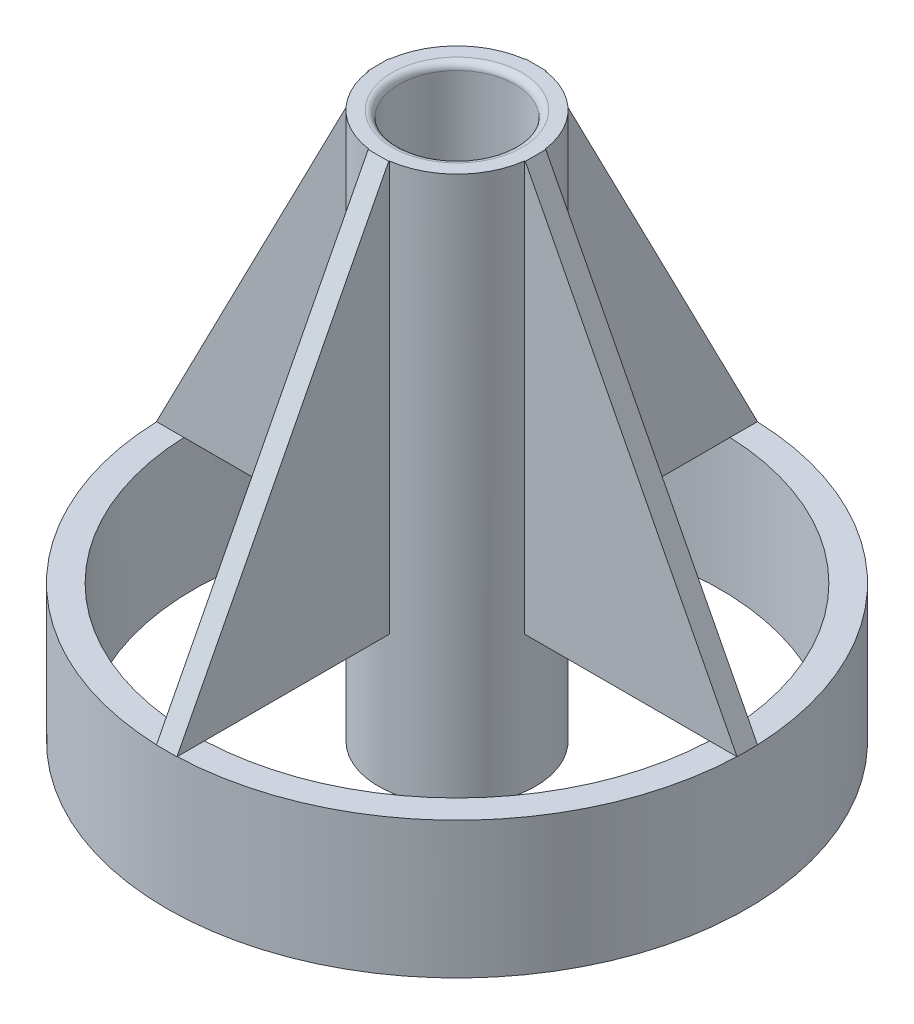
ISO-10303-21;
HEADER;
FILE_DESCRIPTION(('STEP AP214'),'2;1');
FILE_NAME('part.step','',(''),(''),'','','');
FILE_SCHEMA(('AUTOMOTIVE_DESIGN { 1 0 10303 214 1 1 1 1 }'));
ENDSEC;
DATA;
#1=APPLICATION_CONTEXT('core data for automotive mechanical design processes');
#2=APPLICATION_PROTOCOL_DEFINITION('international standard','automotive_design',2000,#1);
#3=PRODUCT_CONTEXT('',#1,'mechanical');
#4=PRODUCT('Part','Part','',(#3));
#5=PRODUCT_RELATED_PRODUCT_CATEGORY('part','',(#4));
#6=PRODUCT_DEFINITION_FORMATION('','',#4);
#7=PRODUCT_DEFINITION_CONTEXT('part definition',#1,'design');
#8=PRODUCT_DEFINITION('design','',#6,#7);
#9=PRODUCT_DEFINITION_SHAPE('','',#8);
#10=(LENGTH_UNIT() NAMED_UNIT(*) SI_UNIT(.MILLI.,.METRE.));
#11=(NAMED_UNIT(*) PLANE_ANGLE_UNIT() SI_UNIT($,.RADIAN.));
#12=(NAMED_UNIT(*) SI_UNIT($,.STERADIAN.) SOLID_ANGLE_UNIT());
#13=UNCERTAINTY_MEASURE_WITH_UNIT(LENGTH_MEASURE(1.E-05),#10,'distance_accuracy_value','');
#14=(GEOMETRIC_REPRESENTATION_CONTEXT(3) GLOBAL_UNCERTAINTY_ASSIGNED_CONTEXT((#13)) GLOBAL_UNIT_ASSIGNED_CONTEXT((#10,
#11,#12)) REPRESENTATION_CONTEXT('',''));
#15=CARTESIAN_POINT('',(0.,0.,0.));
#16=DIRECTION('',(0.,0.,1.));
#17=DIRECTION('',(1.,0.,0.));
#18=AXIS2_PLACEMENT_3D('',#15,#16,#17);
#19=CARTESIAN_POINT('',(-4.25,10.,0.75));
#20=DIRECTION('',(0.,1.,0.));
#21=DIRECTION('',(0.,0.,1.));
#22=AXIS2_PLACEMENT_3D('',#19,#20,#21);
#23=PLANE('',#22);
#24=CARTESIAN_POINT('',(0.,10.,0.));
#25=DIRECTION('',(0.,-1.,0.));
#26=DIRECTION('',(0.,0.,-1.));
#27=AXIS2_PLACEMENT_3D('',#24,#25,#26);
#28=CIRCLE('',#27,5.75);
#29=CARTESIAN_POINT('',(-5.70087712549569,10.,0.75));
#30=VERTEX_POINT('',#29);
#31=CARTESIAN_POINT('',(-5.70087712549569,10.,-0.75));
#32=VERTEX_POINT('',#31);
#33=EDGE_CURVE('E227',#30,#32,#28,.T.);
#34=ORIENTED_EDGE('',*,*,#33,.F.);
#35=DIRECTION('',(1.,0.,0.));
#36=VECTOR('',#35,1.);
#37=CARTESIAN_POINT('',(-5.75,10.,0.75));
#38=LINE('',#37,#36);
#39=CARTESIAN_POINT('',(-19.2353840616713,10.,0.75));
#40=VERTEX_POINT('',#39);
#41=EDGE_CURVE('E584',#40,#30,#38,.T.);
#42=ORIENTED_EDGE('',*,*,#41,.F.);
#43=CARTESIAN_POINT('',(0.,10.,0.));
#44=DIRECTION('',(0.,1.,0.));
#45=DIRECTION('',(0.,0.,1.));
#46=AXIS2_PLACEMENT_3D('',#43,#44,#45);
#47=CIRCLE('',#46,19.25);
#48=CARTESIAN_POINT('',(-19.2353840616713,10.,-0.75));
#49=VERTEX_POINT('',#48);
#50=EDGE_CURVE('E457',#49,#40,#47,.T.);
#51=ORIENTED_EDGE('',*,*,#50,.F.);
#52=DIRECTION('',(1.,0.,0.));
#53=VECTOR('',#52,1.);
#54=CARTESIAN_POINT('',(-4.25,10.,-0.75));
#55=LINE('',#54,#53);
#56=EDGE_CURVE('E549',#49,#32,#55,.T.);
#57=ORIENTED_EDGE('',*,*,#56,.T.);
#58=EDGE_LOOP('',(#34,#42,#51,#57));
#59=FACE_BOUND('',#58,.T.);
#60=ADVANCED_FACE('F38',(#59),#23,.F.);
#61=CARTESIAN_POINT('',(-0.74999999999998,10.,-5.70087712549569));
#62=VERTEX_POINT('',#61);
#63=CARTESIAN_POINT('',(0.75000000000002,10.,-5.70087712549569));
#64=VERTEX_POINT('',#63);
#65=EDGE_CURVE('E213',#62,#64,#28,.T.);
#66=ORIENTED_EDGE('',*,*,#65,.F.);
#67=DIRECTION('',(0.,0.,1.));
#68=VECTOR('',#67,1.);
#69=CARTESIAN_POINT('',(-0.74999999999998,10.,-5.75));
#70=LINE('',#69,#68);
#71=CARTESIAN_POINT('',(-0.749999999999933,10.,-19.2353840616714));
#72=VERTEX_POINT('',#71);
#73=EDGE_CURVE('E265',#72,#62,#70,.T.);
#74=ORIENTED_EDGE('',*,*,#73,.F.);
#75=CARTESIAN_POINT('',(0.750000000000067,10.,-19.2353840616713));
#76=VERTEX_POINT('',#75);
#77=EDGE_CURVE('E244',#76,#72,#47,.T.);
#78=ORIENTED_EDGE('',*,*,#77,.F.);
#79=DIRECTION('',(0.,0.,1.));
#80=VECTOR('',#79,1.);
#81=CARTESIAN_POINT('',(0.750000000000015,10.,-4.25));
#82=LINE('',#81,#80);
#83=EDGE_CURVE('E234',#76,#64,#82,.T.);
#84=ORIENTED_EDGE('',*,*,#83,.T.);
#85=EDGE_LOOP('',(#66,#74,#78,#84));
#86=FACE_BOUND('',#85,.T.);
#87=ADVANCED_FACE('F242',(#86),#23,.F.);
#88=CARTESIAN_POINT('',(5.70087712549569,10.,-0.75));
#89=VERTEX_POINT('',#88);
#90=CARTESIAN_POINT('',(5.70087712549569,10.,0.75));
#91=VERTEX_POINT('',#90);
#92=EDGE_CURVE('E229',#89,#91,#28,.T.);
#93=ORIENTED_EDGE('',*,*,#92,.F.);
#94=DIRECTION('',(-1.,0.,0.));
#95=VECTOR('',#94,1.);
#96=CARTESIAN_POINT('',(5.75,10.,-0.75));
#97=LINE('',#96,#95);
#98=CARTESIAN_POINT('',(19.2353840616713,10.,-0.75));
#99=VERTEX_POINT('',#98);
#100=EDGE_CURVE('E316',#99,#89,#97,.T.);
#101=ORIENTED_EDGE('',*,*,#100,.F.);
#102=CARTESIAN_POINT('',(19.2353840616713,10.,0.75));
#103=VERTEX_POINT('',#102);
#104=EDGE_CURVE('E515',#103,#99,#47,.T.);
#105=ORIENTED_EDGE('',*,*,#104,.F.);
#106=DIRECTION('',(-1.,0.,0.));
#107=VECTOR('',#106,1.);
#108=CARTESIAN_POINT('',(4.25,10.,0.75));
#109=LINE('',#108,#107);
#110=EDGE_CURVE('E321',#103,#91,#109,.T.);
#111=ORIENTED_EDGE('',*,*,#110,.T.);
#112=EDGE_LOOP('',(#93,#101,#105,#111));
#113=FACE_BOUND('',#112,.T.);
#114=ADVANCED_FACE('F417',(#113),#23,.F.);
#115=CARTESIAN_POINT('',(0.74999999999994,10.,5.7008771254957));
#116=VERTEX_POINT('',#115);
#117=CARTESIAN_POINT('',(-0.75000000000006,10.,5.70087712549568));
#118=VERTEX_POINT('',#117);
#119=EDGE_CURVE('E555',#116,#118,#28,.T.);
#120=ORIENTED_EDGE('',*,*,#119,.F.);
#121=DIRECTION('',(0.,0.,-1.));
#122=VECTOR('',#121,1.);
#123=CARTESIAN_POINT('',(0.74999999999994,10.,5.75000000000001));
#124=LINE('',#123,#122);
#125=CARTESIAN_POINT('',(0.749999999999799,10.,19.2353840616714));
#126=VERTEX_POINT('',#125);
#127=EDGE_CURVE('E364',#126,#116,#124,.T.);
#128=ORIENTED_EDGE('',*,*,#127,.F.);
#129=CARTESIAN_POINT('',(-0.750000000000202,10.,19.2353840616713));
#130=VERTEX_POINT('',#129);
#131=EDGE_CURVE('E520',#130,#126,#47,.T.);
#132=ORIENTED_EDGE('',*,*,#131,.F.);
#133=DIRECTION('',(0.,0.,-1.));
#134=VECTOR('',#133,1.);
#135=CARTESIAN_POINT('',(-0.750000000000045,10.,4.24999999999999));
#136=LINE('',#135,#134);
#137=EDGE_CURVE('E369',#130,#118,#136,.T.);
#138=ORIENTED_EDGE('',*,*,#137,.T.);
#139=EDGE_LOOP('',(#120,#128,#132,#138));
#140=FACE_BOUND('',#139,.T.);
#141=ADVANCED_FACE('F696',(#140),#23,.F.);
#142=CARTESIAN_POINT('',(0.,10.,0.));
#143=DIRECTION('',(0.,1.,0.));
#144=DIRECTION('',(0.,0.,1.));
#145=AXIS2_PLACEMENT_3D('',#142,#143,#144);
#146=PLANE('',#145);
#147=CARTESIAN_POINT('',(0.,10.,0.));
#148=DIRECTION('',(0.,1.,0.));
#149=DIRECTION('',(0.,0.,1.));
#150=AXIS2_PLACEMENT_3D('',#147,#148,#149);
#151=CIRCLE('',#150,21.25);
#152=CARTESIAN_POINT('',(0.749999999999778,10.,21.2367605815953));
#153=VERTEX_POINT('',#152);
#154=CARTESIAN_POINT('',(21.2367605815953,10.,0.75));
#155=VERTEX_POINT('',#154);
#156=EDGE_CURVE('E470',#153,#155,#151,.T.);
#157=ORIENTED_EDGE('',*,*,#156,.T.);
#158=EDGE_CURVE('E320',#155,#103,#109,.T.);
#159=ORIENTED_EDGE('',*,*,#158,.T.);
#160=EDGE_CURVE('E54',#126,#103,#47,.T.);
#161=ORIENTED_EDGE('',*,*,#160,.F.);
#162=EDGE_CURVE('E363',#153,#126,#124,.T.);
#163=ORIENTED_EDGE('',*,*,#162,.F.);
#164=EDGE_LOOP('',(#157,#159,#161,#163));
#165=FACE_BOUND('',#164,.T.);
#166=ADVANCED_FACE('F623',(#165),#146,.T.);
#167=CARTESIAN_POINT('',(0.75,0.,0.));
#168=DIRECTION('',(1.,0.,0.));
#169=DIRECTION('',(0.,0.,-1.));
#170=AXIS2_PLACEMENT_3D('',#167,#168,#169);
#171=PLANE('',#170);
#172=ORIENTED_EDGE('',*,*,#127,.T.);
#173=DIRECTION('',(0.,-1.,0.));
#174=VECTOR('',#173,1.);
#175=CARTESIAN_POINT('',(0.74999999999994,40.,5.7008771254957));
#176=LINE('',#175,#174);
#177=CARTESIAN_POINT('',(0.74999999999994,40.,5.7008771254957));
#178=VERTEX_POINT('',#177);
#179=EDGE_CURVE('E378',#116,#178,#176,.F.);
#180=ORIENTED_EDGE('',*,*,#179,.T.);
#181=DIRECTION('',(0.,0.,1.));
#182=VECTOR('',#181,1.);
#183=CARTESIAN_POINT('',(0.74999999999994,40.,5.75000000000001));
#184=LINE('',#183,#182);
#185=CARTESIAN_POINT('',(0.74999999999994,40.,5.75000000000001));
#186=VERTEX_POINT('',#185);
#187=EDGE_CURVE('E381',#178,#186,#184,.T.);
#188=ORIENTED_EDGE('',*,*,#187,.T.);
#189=DIRECTION('',(0.,-0.888425906857428,0.459020051876338));
#190=VECTOR('',#189,1.);
#191=CARTESIAN_POINT('',(0.749999999999777,10.,21.25));
#192=LINE('',#191,#190);
#193=CARTESIAN_POINT('',(0.749999999999777,10.,21.25));
#194=VERTEX_POINT('',#193);
#195=EDGE_CURVE('E345',#186,#194,#192,.T.);
#196=ORIENTED_EDGE('',*,*,#195,.T.);
#197=EDGE_CURVE('E357',#194,#153,#124,.T.);
#198=ORIENTED_EDGE('',*,*,#197,.T.);
#199=ORIENTED_EDGE('',*,*,#162,.T.);
#200=EDGE_LOOP('',(#172,#180,#188,#196,#198,#199));
#201=FACE_BOUND('',#200,.T.);
#202=ADVANCED_FACE('F619',(#201),#171,.T.);
#203=CARTESIAN_POINT('',(-0.75,0.,0.));
#204=DIRECTION('',(1.,0.,0.));
#205=DIRECTION('',(0.,0.,-1.));
#206=AXIS2_PLACEMENT_3D('',#203,#204,#205);
#207=PLANE('',#206);
#208=DIRECTION('',(0.,-1.,0.));
#209=VECTOR('',#208,1.);
#210=CARTESIAN_POINT('',(-0.75000000000006,40.,5.70087712549568));
#211=LINE('',#210,#209);
#212=CARTESIAN_POINT('',(-0.75000000000006,40.,5.70087712549568));
#213=VERTEX_POINT('',#212);
#214=EDGE_CURVE('E370',#118,#213,#211,.F.);
#215=ORIENTED_EDGE('',*,*,#214,.F.);
#216=ORIENTED_EDGE('',*,*,#137,.F.);
#217=CARTESIAN_POINT('',(-0.750000000000222,10.,21.2367605815953));
#218=VERTEX_POINT('',#217);
#219=EDGE_CURVE('E368',#218,#130,#136,.T.);
#220=ORIENTED_EDGE('',*,*,#219,.F.);
#221=CARTESIAN_POINT('',(-0.750000000000223,10.,21.25));
#222=VERTEX_POINT('',#221);
#223=EDGE_CURVE('E362',#222,#218,#136,.T.);
#224=ORIENTED_EDGE('',*,*,#223,.F.);
#225=DIRECTION('',(0.,-0.888425906857428,0.459020051876338));
#226=VECTOR('',#225,1.);
#227=CARTESIAN_POINT('',(-0.750000000000223,10.,21.25));
#228=LINE('',#227,#226);
#229=CARTESIAN_POINT('',(-0.75000000000006,40.,5.74999999999999));
#230=VERTEX_POINT('',#229);
#231=EDGE_CURVE('E337',#230,#222,#228,.T.);
#232=ORIENTED_EDGE('',*,*,#231,.F.);
#233=DIRECTION('',(0.,0.,1.));
#234=VECTOR('',#233,1.);
#235=CARTESIAN_POINT('',(-0.75000000000006,40.,5.74999999999999));
#236=LINE('',#235,#234);
#237=EDGE_CURVE('E374',#213,#230,#236,.T.);
#238=ORIENTED_EDGE('',*,*,#237,.F.);
#239=EDGE_LOOP('',(#215,#216,#220,#224,#232,#238));
#240=FACE_BOUND('',#239,.T.);
#241=ADVANCED_FACE('F622',(#240),#207,.F.);
#242=ORIENTED_EDGE('',*,*,#223,.T.);
#243=CARTESIAN_POINT('',(0.,10.,0.));
#244=DIRECTION('',(0.,1.,0.));
#245=DIRECTION('',(1.,0.,0.));
#246=AXIS2_PLACEMENT_3D('',#243,#244,#245);
#247=CIRCLE('',#246,21.25);
#248=CARTESIAN_POINT('',(-2.2258193535125E-13,10.,21.25));
#249=VERTEX_POINT('',#248);
#250=EDGE_CURVE('E358',#218,#249,#247,.T.);
#251=ORIENTED_EDGE('',*,*,#250,.T.);
#252=DIRECTION('',(-1.,0.,0.));
#253=VECTOR('',#252,1.);
#254=CARTESIAN_POINT('',(0.749999999999777,10.,21.25));
#255=LINE('',#254,#253);
#256=EDGE_CURVE('E340',#249,#222,#255,.T.);
#257=ORIENTED_EDGE('',*,*,#256,.T.);
#258=EDGE_LOOP('',(#242,#251,#257));
#259=FACE_BOUND('',#258,.T.);
#260=ADVANCED_FACE('F627',(#259),#23,.F.);
#261=EDGE_CURVE('E344',#194,#249,#255,.T.);
#262=ORIENTED_EDGE('',*,*,#261,.T.);
#263=EDGE_CURVE('E353',#249,#153,#247,.T.);
#264=ORIENTED_EDGE('',*,*,#263,.T.);
#265=ORIENTED_EDGE('',*,*,#197,.F.);
#266=EDGE_LOOP('',(#262,#264,#265));
#267=FACE_BOUND('',#266,.T.);
#268=ADVANCED_FACE('F632',(#267),#23,.F.);
#269=CARTESIAN_POINT('',(0.749999999999777,10.,21.25));
#270=DIRECTION('',(0.,-0.459020051876338,-0.888425906857428));
#271=DIRECTION('',(0.,0.888425906857428,-0.459020051876338));
#272=AXIS2_PLACEMENT_3D('',#269,#270,#271);
#273=PLANE('',#272);
#274=ORIENTED_EDGE('',*,*,#231,.T.);
#275=ORIENTED_EDGE('',*,*,#256,.F.);
#276=ORIENTED_EDGE('',*,*,#261,.F.);
#277=ORIENTED_EDGE('',*,*,#195,.F.);
#278=DIRECTION('',(-1.,0.,0.));
#279=VECTOR('',#278,1.);
#280=CARTESIAN_POINT('',(0.74999999999994,40.,5.75000000000001));
#281=LINE('',#280,#279);
#282=EDGE_CURVE('E349',#186,#230,#281,.T.);
#283=ORIENTED_EDGE('',*,*,#282,.T.);
#284=EDGE_LOOP('',(#274,#275,#276,#277,#283));
#285=FACE_BOUND('',#284,.T.);
#286=ADVANCED_FACE('F629',(#285),#273,.F.);
#287=CARTESIAN_POINT('',(21.2367605815953,10.,-0.75));
#288=VERTEX_POINT('',#287);
#289=CARTESIAN_POINT('',(0.750000000000074,10.,-21.2367605815953));
#290=VERTEX_POINT('',#289);
#291=EDGE_CURVE('E275',#288,#290,#151,.T.);
#292=ORIENTED_EDGE('',*,*,#291,.T.);
#293=EDGE_CURVE('E246',#290,#76,#82,.T.);
#294=ORIENTED_EDGE('',*,*,#293,.T.);
#295=EDGE_CURVE('E510',#99,#76,#47,.T.);
#296=ORIENTED_EDGE('',*,*,#295,.F.);
#297=EDGE_CURVE('E315',#288,#99,#97,.T.);
#298=ORIENTED_EDGE('',*,*,#297,.F.);
#299=EDGE_LOOP('',(#292,#294,#296,#298));
#300=FACE_BOUND('',#299,.T.);
#301=ADVANCED_FACE('F508',(#300),#146,.T.);
#302=CARTESIAN_POINT('',(0.,0.,-0.75));
#303=DIRECTION('',(0.,0.,-1.));
#304=DIRECTION('',(-1.,0.,0.));
#305=AXIS2_PLACEMENT_3D('',#302,#303,#304);
#306=PLANE('',#305);
#307=ORIENTED_EDGE('',*,*,#100,.T.);
#308=DIRECTION('',(0.,-1.,0.));
#309=VECTOR('',#308,1.);
#310=CARTESIAN_POINT('',(5.70087712549569,40.,-0.75));
#311=LINE('',#310,#309);
#312=CARTESIAN_POINT('',(5.70087712549569,40.,-0.75));
#313=VERTEX_POINT('',#312);
#314=EDGE_CURVE('E329',#89,#313,#311,.F.);
#315=ORIENTED_EDGE('',*,*,#314,.T.);
#316=DIRECTION('',(1.,0.,0.));
#317=VECTOR('',#316,1.);
#318=CARTESIAN_POINT('',(5.75,40.,-0.75));
#319=LINE('',#318,#317);
#320=CARTESIAN_POINT('',(5.75,40.,-0.75));
#321=VERTEX_POINT('',#320);
#322=EDGE_CURVE('E333',#313,#321,#319,.T.);
#323=ORIENTED_EDGE('',*,*,#322,.T.);
#324=DIRECTION('',(0.459020051876338,-0.888425906857428,0.));
#325=VECTOR('',#324,1.);
#326=CARTESIAN_POINT('',(21.25,10.,-0.75));
#327=LINE('',#326,#325);
#328=CARTESIAN_POINT('',(21.25,10.,-0.75));
#329=VERTEX_POINT('',#328);
#330=EDGE_CURVE('E297',#321,#329,#327,.T.);
#331=ORIENTED_EDGE('',*,*,#330,.T.);
#332=EDGE_CURVE('E309',#329,#288,#97,.T.);
#333=ORIENTED_EDGE('',*,*,#332,.T.);
#334=ORIENTED_EDGE('',*,*,#297,.T.);
#335=EDGE_LOOP('',(#307,#315,#323,#331,#333,#334));
#336=FACE_BOUND('',#335,.T.);
#337=ADVANCED_FACE('F528',(#336),#306,.T.);
#338=CARTESIAN_POINT('',(0.,0.,0.75));
#339=DIRECTION('',(0.,0.,-1.));
#340=DIRECTION('',(-1.,0.,0.));
#341=AXIS2_PLACEMENT_3D('',#338,#339,#340);
#342=PLANE('',#341);
#343=DIRECTION('',(0.,-1.,0.));
#344=VECTOR('',#343,1.);
#345=CARTESIAN_POINT('',(5.70087712549569,40.,0.75));
#346=LINE('',#345,#344);
#347=CARTESIAN_POINT('',(5.70087712549569,40.,0.75));
#348=VERTEX_POINT('',#347);
#349=EDGE_CURVE('E322',#91,#348,#346,.F.);
#350=ORIENTED_EDGE('',*,*,#349,.F.);
#351=ORIENTED_EDGE('',*,*,#110,.F.);
#352=ORIENTED_EDGE('',*,*,#158,.F.);
#353=CARTESIAN_POINT('',(21.25,10.,0.75));
#354=VERTEX_POINT('',#353);
#355=EDGE_CURVE('E314',#354,#155,#109,.T.);
#356=ORIENTED_EDGE('',*,*,#355,.F.);
#357=DIRECTION('',(0.459020051876338,-0.888425906857428,0.));
#358=VECTOR('',#357,1.);
#359=CARTESIAN_POINT('',(21.25,10.,0.75));
#360=LINE('',#359,#358);
#361=CARTESIAN_POINT('',(5.75,40.,0.75));
#362=VERTEX_POINT('',#361);
#363=EDGE_CURVE('E288',#362,#354,#360,.T.);
#364=ORIENTED_EDGE('',*,*,#363,.F.);
#365=DIRECTION('',(1.,0.,0.));
#366=VECTOR('',#365,1.);
#367=CARTESIAN_POINT('',(5.75,40.,0.75));
#368=LINE('',#367,#366);
#369=EDGE_CURVE('E325',#348,#362,#368,.T.);
#370=ORIENTED_EDGE('',*,*,#369,.F.);
#371=EDGE_LOOP('',(#350,#351,#352,#356,#364,#370));
#372=FACE_BOUND('',#371,.T.);
#373=ADVANCED_FACE('F636',(#372),#342,.F.);
#374=ORIENTED_EDGE('',*,*,#355,.T.);
#375=CARTESIAN_POINT('',(0.,10.,0.));
#376=DIRECTION('',(0.,1.,0.));
#377=DIRECTION('',(0.,0.,-1.));
#378=AXIS2_PLACEMENT_3D('',#375,#376,#377);
#379=CIRCLE('',#378,21.25);
#380=CARTESIAN_POINT('',(21.25,10.,0.));
#381=VERTEX_POINT('',#380);
#382=EDGE_CURVE('E310',#155,#381,#379,.T.);
#383=ORIENTED_EDGE('',*,*,#382,.T.);
#384=DIRECTION('',(0.,0.,1.));
#385=VECTOR('',#384,1.);
#386=CARTESIAN_POINT('',(21.25,10.,-0.75));
#387=LINE('',#386,#385);
#388=EDGE_CURVE('E291',#381,#354,#387,.T.);
#389=ORIENTED_EDGE('',*,*,#388,.T.);
#390=EDGE_LOOP('',(#374,#383,#389));
#391=FACE_BOUND('',#390,.T.);
#392=ADVANCED_FACE('F639',(#391),#23,.F.);
#393=EDGE_CURVE('E296',#329,#381,#387,.T.);
#394=ORIENTED_EDGE('',*,*,#393,.T.);
#395=EDGE_CURVE('E305',#381,#288,#379,.T.);
#396=ORIENTED_EDGE('',*,*,#395,.T.);
#397=ORIENTED_EDGE('',*,*,#332,.F.);
#398=EDGE_LOOP('',(#394,#396,#397));
#399=FACE_BOUND('',#398,.T.);
#400=ADVANCED_FACE('F645',(#399),#23,.F.);
#401=CARTESIAN_POINT('',(21.25,10.,-0.75));
#402=DIRECTION('',(-0.888425906857428,-0.459020051876338,0.));
#403=DIRECTION('',(-0.459020051876338,0.888425906857428,0.));
#404=AXIS2_PLACEMENT_3D('',#401,#402,#403);
#405=PLANE('',#404);
#406=ORIENTED_EDGE('',*,*,#363,.T.);
#407=ORIENTED_EDGE('',*,*,#388,.F.);
#408=ORIENTED_EDGE('',*,*,#393,.F.);
#409=ORIENTED_EDGE('',*,*,#330,.F.);
#410=DIRECTION('',(0.,0.,1.));
#411=VECTOR('',#410,1.);
#412=CARTESIAN_POINT('',(5.75,40.,-0.75));
#413=LINE('',#412,#411);
#414=EDGE_CURVE('E301',#321,#362,#413,.T.);
#415=ORIENTED_EDGE('',*,*,#414,.T.);
#416=EDGE_LOOP('',(#406,#407,#408,#409,#415));
#417=FACE_BOUND('',#416,.T.);
#418=ADVANCED_FACE('F641',(#417),#405,.F.);
#419=CARTESIAN_POINT('',(-0.749999999999926,10.,-21.2367605815953));
#420=VERTEX_POINT('',#419);
#421=CARTESIAN_POINT('',(-21.2367605815953,10.,-0.75));
#422=VERTEX_POINT('',#421);
#423=EDGE_CURVE('E479',#420,#422,#151,.T.);
#424=ORIENTED_EDGE('',*,*,#423,.T.);
#425=EDGE_CURVE('E480',#422,#49,#55,.T.);
#426=ORIENTED_EDGE('',*,*,#425,.T.);
#427=EDGE_CURVE('E517',#72,#49,#47,.T.);
#428=ORIENTED_EDGE('',*,*,#427,.F.);
#429=EDGE_CURVE('E264',#420,#72,#70,.T.);
#430=ORIENTED_EDGE('',*,*,#429,.F.);
#431=EDGE_LOOP('',(#424,#426,#428,#430));
#432=FACE_BOUND('',#431,.T.);
#433=ADVANCED_FACE('F644',(#432),#146,.T.);
#434=CARTESIAN_POINT('',(-0.75,0.,0.));
#435=DIRECTION('',(-1.,0.,0.));
#436=DIRECTION('',(0.,0.,1.));
#437=AXIS2_PLACEMENT_3D('',#434,#435,#436);
#438=PLANE('',#437);
#439=ORIENTED_EDGE('',*,*,#73,.T.);
#440=DIRECTION('',(0.,-1.,0.));
#441=VECTOR('',#440,1.);
#442=CARTESIAN_POINT('',(-0.74999999999998,40.,-5.70087712549569));
#443=LINE('',#442,#441);
#444=CARTESIAN_POINT('',(-0.74999999999998,40.,-5.70087712549569));
#445=VERTEX_POINT('',#444);
#446=EDGE_CURVE('E221',#62,#445,#443,.F.);
#447=ORIENTED_EDGE('',*,*,#446,.T.);
#448=DIRECTION('',(0.,0.,-1.));
#449=VECTOR('',#448,1.);
#450=CARTESIAN_POINT('',(-0.74999999999998,40.,-5.75));
#451=LINE('',#450,#449);
#452=CARTESIAN_POINT('',(-0.74999999999998,40.,-5.75));
#453=VERTEX_POINT('',#452);
#454=EDGE_CURVE('E276',#445,#453,#451,.T.);
#455=ORIENTED_EDGE('',*,*,#454,.T.);
#456=DIRECTION('',(0.,-0.888425906857428,-0.459020051876338));
#457=VECTOR('',#456,1.);
#458=CARTESIAN_POINT('',(-0.749999999999926,10.,-21.25));
#459=LINE('',#458,#457);
#460=CARTESIAN_POINT('',(-0.749999999999926,10.,-21.25));
#461=VERTEX_POINT('',#460);
#462=EDGE_CURVE('E489',#453,#461,#459,.T.);
#463=ORIENTED_EDGE('',*,*,#462,.T.);
#464=EDGE_CURVE('E253',#461,#420,#70,.T.);
#465=ORIENTED_EDGE('',*,*,#464,.T.);
#466=ORIENTED_EDGE('',*,*,#429,.T.);
#467=EDGE_LOOP('',(#439,#447,#455,#463,#465,#466));
#468=FACE_BOUND('',#467,.T.);
#469=ADVANCED_FACE('F497',(#468),#438,.T.);
#470=CARTESIAN_POINT('',(0.75,0.,0.));
#471=DIRECTION('',(-1.,0.,0.));
#472=DIRECTION('',(0.,0.,1.));
#473=AXIS2_PLACEMENT_3D('',#470,#471,#472);
#474=PLANE('',#473);
#475=DIRECTION('',(0.,-1.,0.));
#476=VECTOR('',#475,1.);
#477=CARTESIAN_POINT('',(0.75000000000002,40.,-5.70087712549569));
#478=LINE('',#477,#476);
#479=CARTESIAN_POINT('',(0.75000000000002,40.,-5.70087712549569));
#480=VERTEX_POINT('',#479);
#481=EDGE_CURVE('E218',#64,#480,#478,.F.);
#482=ORIENTED_EDGE('',*,*,#481,.F.);
#483=ORIENTED_EDGE('',*,*,#83,.F.);
#484=ORIENTED_EDGE('',*,*,#293,.F.);
#485=CARTESIAN_POINT('',(0.750000000000074,10.,-21.25));
#486=VERTEX_POINT('',#485);
#487=EDGE_CURVE('E248',#486,#290,#82,.T.);
#488=ORIENTED_EDGE('',*,*,#487,.F.);
#489=DIRECTION('',(0.,-0.888425906857428,-0.459020051876338));
#490=VECTOR('',#489,1.);
#491=CARTESIAN_POINT('',(0.750000000000074,10.,-21.25));
#492=LINE('',#491,#490);
#493=CARTESIAN_POINT('',(0.75000000000002,40.,-5.75));
#494=VERTEX_POINT('',#493);
#495=EDGE_CURVE('E481',#494,#486,#492,.T.);
#496=ORIENTED_EDGE('',*,*,#495,.F.);
#497=DIRECTION('',(0.,0.,-1.));
#498=VECTOR('',#497,1.);
#499=CARTESIAN_POINT('',(0.75000000000002,40.,-5.75));
#500=LINE('',#499,#498);
#501=EDGE_CURVE('E237',#480,#494,#500,.T.);
#502=ORIENTED_EDGE('',*,*,#501,.F.);
#503=EDGE_LOOP('',(#482,#483,#484,#488,#496,#502));
#504=FACE_BOUND('',#503,.T.);
#505=ADVANCED_FACE('F232',(#504),#474,.F.);
#506=ORIENTED_EDGE('',*,*,#487,.T.);
#507=CARTESIAN_POINT('',(0.,10.,0.));
#508=DIRECTION('',(0.,1.,0.));
#509=DIRECTION('',(-1.,0.,0.));
#510=AXIS2_PLACEMENT_3D('',#507,#508,#509);
#511=CIRCLE('',#510,21.25);
#512=CARTESIAN_POINT('',(0.,10.,-21.25));
#513=VERTEX_POINT('',#512);
#514=EDGE_CURVE('E239',#290,#513,#511,.T.);
#515=ORIENTED_EDGE('',*,*,#514,.T.);
#516=DIRECTION('',(1.,0.,0.));
#517=VECTOR('',#516,1.);
#518=CARTESIAN_POINT('',(-0.749999999999926,10.,-21.25));
#519=LINE('',#518,#517);
#520=EDGE_CURVE('E484',#513,#486,#519,.T.);
#521=ORIENTED_EDGE('',*,*,#520,.T.);
#522=EDGE_LOOP('',(#506,#515,#521));
#523=FACE_BOUND('',#522,.T.);
#524=ADVANCED_FACE('F506',(#523),#23,.F.);
#525=EDGE_CURVE('E488',#461,#513,#519,.T.);
#526=ORIENTED_EDGE('',*,*,#525,.T.);
#527=EDGE_CURVE('E262',#513,#420,#511,.T.);
#528=ORIENTED_EDGE('',*,*,#527,.T.);
#529=ORIENTED_EDGE('',*,*,#464,.F.);
#530=EDGE_LOOP('',(#526,#528,#529));
#531=FACE_BOUND('',#530,.T.);
#532=ADVANCED_FACE('F432',(#531),#23,.F.);
#533=CARTESIAN_POINT('',(-0.749999999999926,10.,-21.25));
#534=DIRECTION('',(0.,-0.459020051876338,0.888425906857428));
#535=DIRECTION('',(0.,0.888425906857428,0.459020051876338));
#536=AXIS2_PLACEMENT_3D('',#533,#534,#535);
#537=PLANE('',#536);
#538=ORIENTED_EDGE('',*,*,#495,.T.);
#539=ORIENTED_EDGE('',*,*,#520,.F.);
#540=ORIENTED_EDGE('',*,*,#525,.F.);
#541=ORIENTED_EDGE('',*,*,#462,.F.);
#542=DIRECTION('',(1.,0.,0.));
#543=VECTOR('',#542,1.);
#544=CARTESIAN_POINT('',(-0.74999999999998,40.,-5.75));
#545=LINE('',#544,#543);
#546=EDGE_CURVE('E273',#453,#494,#545,.T.);
#547=ORIENTED_EDGE('',*,*,#546,.T.);
#548=EDGE_LOOP('',(#538,#539,#540,#541,#547));
#549=FACE_BOUND('',#548,.T.);
#550=ADVANCED_FACE('F495',(#549),#537,.F.);
#551=CARTESIAN_POINT('',(0.,0.,0.75));
#552=DIRECTION('',(0.,0.,1.));
#553=DIRECTION('',(1.,0.,0.));
#554=AXIS2_PLACEMENT_3D('',#551,#552,#553);
#555=PLANE('',#554);
#556=ORIENTED_EDGE('',*,*,#41,.T.);
#557=DIRECTION('',(0.,-1.,0.));
#558=VECTOR('',#557,1.);
#559=CARTESIAN_POINT('',(-5.70087712549569,40.,0.75));
#560=LINE('',#559,#558);
#561=CARTESIAN_POINT('',(-5.70087712549569,40.,0.75));
#562=VERTEX_POINT('',#561);
#563=EDGE_CURVE('E543',#30,#562,#560,.F.);
#564=ORIENTED_EDGE('',*,*,#563,.T.);
#565=DIRECTION('',(-1.,0.,0.));
#566=VECTOR('',#565,1.);
#567=CARTESIAN_POINT('',(-5.75,40.,0.75));
#568=LINE('',#567,#566);
#569=CARTESIAN_POINT('',(-5.75,40.,0.75));
#570=VERTEX_POINT('',#569);
#571=EDGE_CURVE('E588',#562,#570,#568,.T.);
#572=ORIENTED_EDGE('',*,*,#571,.T.);
#573=DIRECTION('',(-0.459020051876338,-0.888425906857428,0.));
#574=VECTOR('',#573,1.);
#575=CARTESIAN_POINT('',(-21.25,10.,0.75));
#576=LINE('',#575,#574);
#577=CARTESIAN_POINT('',(-21.25,10.,0.75));
#578=VERTEX_POINT('',#577);
#579=EDGE_CURVE('E452',#570,#578,#576,.T.);
#580=ORIENTED_EDGE('',*,*,#579,.T.);
#581=CARTESIAN_POINT('',(-21.2367605815953,10.,0.75));
#582=VERTEX_POINT('',#581);
#583=EDGE_CURVE('E440',#578,#582,#38,.T.);
#584=ORIENTED_EDGE('',*,*,#583,.T.);
#585=EDGE_CURVE('E469',#582,#40,#38,.T.);
#586=ORIENTED_EDGE('',*,*,#585,.T.);
#587=EDGE_LOOP('',(#556,#564,#572,#580,#584,#586));
#588=FACE_BOUND('',#587,.T.);
#589=ADVANCED_FACE('F605',(#588),#555,.T.);
#590=CARTESIAN_POINT('',(0.,0.,-0.75));
#591=DIRECTION('',(0.,0.,1.));
#592=DIRECTION('',(1.,0.,0.));
#593=AXIS2_PLACEMENT_3D('',#590,#591,#592);
#594=PLANE('',#593);
#595=DIRECTION('',(0.,-1.,0.));
#596=VECTOR('',#595,1.);
#597=CARTESIAN_POINT('',(-5.70087712549569,40.,-0.75));
#598=LINE('',#597,#596);
#599=CARTESIAN_POINT('',(-5.70087712549569,40.,-0.75));
#600=VERTEX_POINT('',#599);
#601=EDGE_CURVE('E475',#32,#600,#598,.F.);
#602=ORIENTED_EDGE('',*,*,#601,.F.);
#603=ORIENTED_EDGE('',*,*,#56,.F.);
#604=ORIENTED_EDGE('',*,*,#425,.F.);
#605=CARTESIAN_POINT('',(-21.25,10.,-0.75));
#606=VERTEX_POINT('',#605);
#607=EDGE_CURVE('E573',#606,#422,#55,.T.);
#608=ORIENTED_EDGE('',*,*,#607,.F.);
#609=DIRECTION('',(-0.459020051876338,-0.888425906857428,0.));
#610=VECTOR('',#609,1.);
#611=CARTESIAN_POINT('',(-21.25,10.,-0.75));
#612=LINE('',#611,#610);
#613=CARTESIAN_POINT('',(-5.75,40.,-0.75));
#614=VERTEX_POINT('',#613);
#615=EDGE_CURVE('E454',#614,#606,#612,.T.);
#616=ORIENTED_EDGE('',*,*,#615,.F.);
#617=DIRECTION('',(-1.,0.,0.));
#618=VECTOR('',#617,1.);
#619=CARTESIAN_POINT('',(-5.75,40.,-0.75));
#620=LINE('',#619,#618);
#621=EDGE_CURVE('E570',#600,#614,#620,.T.);
#622=ORIENTED_EDGE('',*,*,#621,.F.);
#623=EDGE_LOOP('',(#602,#603,#604,#608,#616,#622));
#624=FACE_BOUND('',#623,.T.);
#625=ADVANCED_FACE('F566',(#624),#594,.F.);
#626=EDGE_CURVE('E474',#582,#218,#151,.T.);
#627=ORIENTED_EDGE('',*,*,#626,.T.);
#628=ORIENTED_EDGE('',*,*,#219,.T.);
#629=EDGE_CURVE('E461',#40,#130,#47,.T.);
#630=ORIENTED_EDGE('',*,*,#629,.F.);
#631=ORIENTED_EDGE('',*,*,#585,.F.);
#632=EDGE_LOOP('',(#627,#628,#630,#631));
#633=FACE_BOUND('',#632,.T.);
#634=ADVANCED_FACE('F604',(#633),#146,.T.);
#635=CARTESIAN_POINT('',(0.,0.,0.));
#636=DIRECTION('',(0.,1.,0.));
#637=DIRECTION('',(0.,0.,1.));
#638=AXIS2_PLACEMENT_3D('',#635,#636,#637);
#639=PLANE('',#638);
#640=CARTESIAN_POINT('',(0.,0.,0.));
#641=DIRECTION('',(0.,1.,0.));
#642=DIRECTION('',(0.,0.,1.));
#643=AXIS2_PLACEMENT_3D('',#640,#641,#642);
#644=CIRCLE('',#643,21.25);
#645=CARTESIAN_POINT('',(0.,0.,21.25));
#646=VERTEX_POINT('',#645);
#647=EDGE_CURVE('E460',#646,#646,#644,.T.);
#648=ORIENTED_EDGE('',*,*,#647,.F.);
#649=EDGE_LOOP('',(#648));
#650=FACE_BOUND('',#649,.T.);
#651=CARTESIAN_POINT('',(0.,0.,0.));
#652=DIRECTION('',(0.,1.,0.));
#653=DIRECTION('',(0.,0.,1.));
#654=AXIS2_PLACEMENT_3D('',#651,#652,#653);
#655=CIRCLE('',#654,19.25);
#656=CARTESIAN_POINT('',(0.,0.,19.25));
#657=VERTEX_POINT('',#656);
#658=EDGE_CURVE('E450',#657,#657,#655,.T.);
#659=ORIENTED_EDGE('',*,*,#658,.T.);
#660=EDGE_LOOP('',(#659));
#661=FACE_BOUND('',#660,.T.);
#662=ADVANCED_FACE('F655',(#650,#661),#639,.F.);
#663=CARTESIAN_POINT('',(0.,10.,0.));
#664=DIRECTION('',(0.,-1.,0.));
#665=DIRECTION('',(0.,0.,-1.));
#666=AXIS2_PLACEMENT_3D('',#663,#664,#665);
#667=CYLINDRICAL_SURFACE('',#666,21.25);
#668=ORIENTED_EDGE('',*,*,#626,.F.);
#669=CARTESIAN_POINT('',(-21.25,10.,0.));
#670=VERTEX_POINT('',#669);
#671=EDGE_CURVE('E438',#670,#582,#151,.T.);
#672=ORIENTED_EDGE('',*,*,#671,.F.);
#673=EDGE_CURVE('E465',#422,#670,#151,.T.);
#674=ORIENTED_EDGE('',*,*,#673,.F.);
#675=ORIENTED_EDGE('',*,*,#423,.F.);
#676=ORIENTED_EDGE('',*,*,#527,.F.);
#677=ORIENTED_EDGE('',*,*,#514,.F.);
#678=ORIENTED_EDGE('',*,*,#291,.F.);
#679=ORIENTED_EDGE('',*,*,#395,.F.);
#680=ORIENTED_EDGE('',*,*,#382,.F.);
#681=ORIENTED_EDGE('',*,*,#156,.F.);
#682=ORIENTED_EDGE('',*,*,#263,.F.);
#683=ORIENTED_EDGE('',*,*,#250,.F.);
#684=EDGE_LOOP('',(#668,#672,#674,#675,#676,#677,#678,#679,#680,#681,#682,#683));
#685=FACE_BOUND('',#684,.T.);
#686=ORIENTED_EDGE('',*,*,#647,.T.);
#687=EDGE_LOOP('',(#686));
#688=FACE_BOUND('',#687,.T.);
#689=ADVANCED_FACE('F503',(#685,#688),#667,.T.);
#690=CARTESIAN_POINT('',(0.,10.,0.));
#691=DIRECTION('',(0.,-1.,0.));
#692=DIRECTION('',(0.,0.,-1.));
#693=AXIS2_PLACEMENT_3D('',#690,#691,#692);
#694=CYLINDRICAL_SURFACE('',#693,19.25);
#695=ORIENTED_EDGE('',*,*,#629,.T.);
#696=ORIENTED_EDGE('',*,*,#131,.T.);
#697=ORIENTED_EDGE('',*,*,#160,.T.);
#698=ORIENTED_EDGE('',*,*,#104,.T.);
#699=ORIENTED_EDGE('',*,*,#295,.T.);
#700=ORIENTED_EDGE('',*,*,#77,.T.);
#701=ORIENTED_EDGE('',*,*,#427,.T.);
#702=ORIENTED_EDGE('',*,*,#50,.T.);
#703=EDGE_LOOP('',(#695,#696,#697,#698,#699,#700,#701,#702));
#704=FACE_BOUND('',#703,.T.);
#705=ORIENTED_EDGE('',*,*,#658,.F.);
#706=EDGE_LOOP('',(#705));
#707=FACE_BOUND('',#706,.T.);
#708=ADVANCED_FACE('F430',(#704,#707),#694,.F.);
#709=ORIENTED_EDGE('',*,*,#607,.T.);
#710=ORIENTED_EDGE('',*,*,#673,.T.);
#711=DIRECTION('',(0.,0.,-1.));
#712=VECTOR('',#711,1.);
#713=CARTESIAN_POINT('',(-21.25,10.,0.75));
#714=LINE('',#713,#712);
#715=EDGE_CURVE('E446',#670,#606,#714,.T.);
#716=ORIENTED_EDGE('',*,*,#715,.T.);
#717=EDGE_LOOP('',(#709,#710,#716));
#718=FACE_BOUND('',#717,.T.);
#719=ADVANCED_FACE('F422',(#718),#23,.F.);
#720=EDGE_CURVE('E437',#578,#670,#714,.T.);
#721=ORIENTED_EDGE('',*,*,#720,.T.);
#722=ORIENTED_EDGE('',*,*,#671,.T.);
#723=ORIENTED_EDGE('',*,*,#583,.F.);
#724=EDGE_LOOP('',(#721,#722,#723));
#725=FACE_BOUND('',#724,.T.);
#726=ADVANCED_FACE('F413',(#725),#23,.F.);
#727=CARTESIAN_POINT('',(-5.75,40.,0.75));
#728=DIRECTION('',(0.,-1.,0.));
#729=DIRECTION('',(0.,0.,-1.));
#730=AXIS2_PLACEMENT_3D('',#727,#728,#729);
#731=PLANE('',#730);
#732=CARTESIAN_POINT('',(0.,40.,0.));
#733=DIRECTION('',(0.,-1.,0.));
#734=DIRECTION('',(0.,0.,-1.));
#735=AXIS2_PLACEMENT_3D('',#732,#733,#734);
#736=CIRCLE('',#735,4.75);
#737=CARTESIAN_POINT('',(0.,40.,-4.75));
#738=VERTEX_POINT('',#737);
#739=EDGE_CURVE('E389',#738,#738,#736,.T.);
#740=ORIENTED_EDGE('',*,*,#739,.T.);
#741=EDGE_LOOP('',(#740));
#742=FACE_BOUND('',#741,.T.);
#743=CARTESIAN_POINT('',(0.,40.,0.));
#744=DIRECTION('',(0.,1.,0.));
#745=DIRECTION('',(0.,0.,1.));
#746=AXIS2_PLACEMENT_3D('',#743,#744,#745);
#747=CIRCLE('',#746,5.75);
#748=EDGE_CURVE('E536',#562,#213,#747,.T.);
#749=ORIENTED_EDGE('',*,*,#748,.T.);
#750=ORIENTED_EDGE('',*,*,#237,.T.);
#751=ORIENTED_EDGE('',*,*,#282,.F.);
#752=ORIENTED_EDGE('',*,*,#187,.F.);
#753=EDGE_CURVE('E62',#178,#348,#747,.T.);
#754=ORIENTED_EDGE('',*,*,#753,.T.);
#755=ORIENTED_EDGE('',*,*,#369,.T.);
#756=ORIENTED_EDGE('',*,*,#414,.F.);
#757=ORIENTED_EDGE('',*,*,#322,.F.);
#758=EDGE_CURVE('E292',#313,#480,#747,.T.);
#759=ORIENTED_EDGE('',*,*,#758,.T.);
#760=ORIENTED_EDGE('',*,*,#501,.T.);
#761=ORIENTED_EDGE('',*,*,#546,.F.);
#762=ORIENTED_EDGE('',*,*,#454,.F.);
#763=EDGE_CURVE('E485',#445,#600,#747,.T.);
#764=ORIENTED_EDGE('',*,*,#763,.T.);
#765=ORIENTED_EDGE('',*,*,#621,.T.);
#766=DIRECTION('',(0.,0.,-1.));
#767=VECTOR('',#766,1.);
#768=CARTESIAN_POINT('',(-5.75,40.,0.75));
#769=LINE('',#768,#767);
#770=EDGE_CURVE('E445',#570,#614,#769,.T.);
#771=ORIENTED_EDGE('',*,*,#770,.F.);
#772=ORIENTED_EDGE('',*,*,#571,.F.);
#773=EDGE_LOOP('',(#749,#750,#751,#752,#754,#755,#756,#757,#759,#760,#761,#762,#764,#765,#771,#772));
#774=FACE_BOUND('',#773,.T.);
#775=ADVANCED_FACE('F421',(#742,#774),#731,.F.);
#776=CARTESIAN_POINT('',(-21.25,10.,0.75));
#777=DIRECTION('',(0.888425906857428,-0.459020051876338,0.));
#778=DIRECTION('',(0.459020051876338,0.888425906857428,0.));
#779=AXIS2_PLACEMENT_3D('',#776,#777,#778);
#780=PLANE('',#779);
#781=ORIENTED_EDGE('',*,*,#615,.T.);
#782=ORIENTED_EDGE('',*,*,#715,.F.);
#783=ORIENTED_EDGE('',*,*,#720,.F.);
#784=ORIENTED_EDGE('',*,*,#579,.F.);
#785=ORIENTED_EDGE('',*,*,#770,.T.);
#786=EDGE_LOOP('',(#781,#782,#783,#784,#785));
#787=FACE_BOUND('',#786,.T.);
#788=ADVANCED_FACE('F428',(#787),#780,.F.);
#789=CARTESIAN_POINT('',(0.,40.,0.));
#790=DIRECTION('',(0.,-1.,0.));
#791=DIRECTION('',(0.,0.,-1.));
#792=AXIS2_PLACEMENT_3D('',#789,#790,#791);
#793=CYLINDRICAL_SURFACE('',#792,5.75);
#794=ORIENTED_EDGE('',*,*,#563,.F.);
#795=ORIENTED_EDGE('',*,*,#33,.T.);
#796=ORIENTED_EDGE('',*,*,#601,.T.);
#797=ORIENTED_EDGE('',*,*,#763,.F.);
#798=ORIENTED_EDGE('',*,*,#446,.F.);
#799=ORIENTED_EDGE('',*,*,#65,.T.);
#800=ORIENTED_EDGE('',*,*,#481,.T.);
#801=ORIENTED_EDGE('',*,*,#758,.F.);
#802=ORIENTED_EDGE('',*,*,#314,.F.);
#803=ORIENTED_EDGE('',*,*,#92,.T.);
#804=ORIENTED_EDGE('',*,*,#349,.T.);
#805=ORIENTED_EDGE('',*,*,#753,.F.);
#806=ORIENTED_EDGE('',*,*,#179,.F.);
#807=ORIENTED_EDGE('',*,*,#119,.T.);
#808=ORIENTED_EDGE('',*,*,#214,.T.);
#809=ORIENTED_EDGE('',*,*,#748,.F.);
#810=EDGE_LOOP('',(#794,#795,#796,#797,#798,#799,#800,#801,#802,#803,#804,#805,#806,#807,#808,#809));
#811=FACE_BOUND('',#810,.T.);
#812=CARTESIAN_POINT('',(0.,0.,0.));
#813=DIRECTION('',(0.,-1.,0.));
#814=DIRECTION('',(0.,0.,-1.));
#815=AXIS2_PLACEMENT_3D('',#812,#813,#814);
#816=CIRCLE('',#815,5.75);
#817=CARTESIAN_POINT('',(0.,0.,-5.75));
#818=VERTEX_POINT('',#817);
#819=EDGE_CURVE('E544',#818,#818,#816,.T.);
#820=ORIENTED_EDGE('',*,*,#819,.F.);
#821=EDGE_LOOP('',(#820));
#822=FACE_BOUND('',#821,.T.);
#823=ADVANCED_FACE('F216',(#811,#822),#793,.T.);
#824=CARTESIAN_POINT('',(0.,40.,0.));
#825=DIRECTION('',(0.,-1.,0.));
#826=DIRECTION('',(0.,0.,-1.));
#827=AXIS2_PLACEMENT_3D('',#824,#825,#826);
#828=CYLINDRICAL_SURFACE('',#827,4.25);
#829=CARTESIAN_POINT('',(0.,0.5,0.));
#830=DIRECTION('',(0.,-1.,0.));
#831=DIRECTION('',(0.,0.,-1.));
#832=AXIS2_PLACEMENT_3D('',#829,#830,#831);
#833=CIRCLE('',#832,4.25);
#834=CARTESIAN_POINT('',(0.,0.5,-4.25));
#835=VERTEX_POINT('',#834);
#836=EDGE_CURVE('E47',#835,#835,#833,.T.);
#837=ORIENTED_EDGE('',*,*,#836,.T.);
#838=EDGE_LOOP('',(#837));
#839=FACE_BOUND('',#838,.T.);
#840=CARTESIAN_POINT('',(0.,39.5,0.));
#841=DIRECTION('',(0.,-1.,0.));
#842=DIRECTION('',(0.,0.,-1.));
#843=AXIS2_PLACEMENT_3D('',#840,#841,#842);
#844=CIRCLE('',#843,4.25);
#845=CARTESIAN_POINT('',(0.,39.5,-4.25));
#846=VERTEX_POINT('',#845);
#847=EDGE_CURVE('E385',#846,#846,#844,.F.);
#848=ORIENTED_EDGE('',*,*,#847,.T.);
#849=EDGE_LOOP('',(#848));
#850=FACE_BOUND('',#849,.T.);
#851=ADVANCED_FACE('F396',(#839,#850),#828,.F.);
#852=CARTESIAN_POINT('',(0.,39.5,0.));
#853=DIRECTION('',(0.,-1.,0.));
#854=DIRECTION('',(0.,0.,-1.));
#855=AXIS2_PLACEMENT_3D('',#852,#853,#854);
#856=TOROIDAL_SURFACE('',#855,4.75,0.5);
#857=ORIENTED_EDGE('',*,*,#739,.F.);
#858=EDGE_LOOP('',(#857));
#859=FACE_BOUND('',#858,.T.);
#860=ORIENTED_EDGE('',*,*,#847,.F.);
#861=EDGE_LOOP('',(#860));
#862=FACE_BOUND('',#861,.T.);
#863=ADVANCED_FACE('F406',(#859,#862),#856,.T.);
#864=CARTESIAN_POINT('',(0.,0.,0.));
#865=DIRECTION('',(0.,-1.,0.));
#866=DIRECTION('',(0.,0.,-1.));
#867=AXIS2_PLACEMENT_3D('',#864,#865,#866);
#868=PLANE('',#867);
#869=CARTESIAN_POINT('',(0.,0.,0.));
#870=DIRECTION('',(0.,-1.,0.));
#871=DIRECTION('',(0.,0.,-1.));
#872=AXIS2_PLACEMENT_3D('',#869,#870,#871);
#873=CIRCLE('',#872,4.75);
#874=CARTESIAN_POINT('',(0.,0.,-4.75));
#875=VERTEX_POINT('',#874);
#876=EDGE_CURVE('E11',#875,#875,#873,.F.);
#877=ORIENTED_EDGE('',*,*,#876,.T.);
#878=EDGE_LOOP('',(#877));
#879=FACE_BOUND('',#878,.T.);
#880=ORIENTED_EDGE('',*,*,#819,.T.);
#881=EDGE_LOOP('',(#880));
#882=FACE_BOUND('',#881,.T.);
#883=ADVANCED_FACE('F400',(#879,#882),#868,.T.);
#884=CARTESIAN_POINT('',(0.,0.5,0.));
#885=DIRECTION('',(0.,-1.,0.));
#886=DIRECTION('',(0.,0.,-1.));
#887=AXIS2_PLACEMENT_3D('',#884,#885,#886);
#888=TOROIDAL_SURFACE('',#887,4.75,0.5);
#889=ORIENTED_EDGE('',*,*,#876,.F.);
#890=EDGE_LOOP('',(#889));
#891=FACE_BOUND('',#890,.T.);
#892=ORIENTED_EDGE('',*,*,#836,.F.);
#893=EDGE_LOOP('',(#892));
#894=FACE_BOUND('',#893,.T.);
#895=ADVANCED_FACE('F40',(#891,#894),#888,.T.);
#896=CLOSED_SHELL('',(#60,#87,#114,#141,#166,#202,#241,#260,#268,#286,#301,#337,#373,#392,#400,
#418,#433,#469,#505,#524,#532,#550,#589,#625,#634,#662,#689,#708,#719,#726,#775,#788,#823,#851,
#863,#883,#895));
#897=MANIFOLD_SOLID_BREP('B2',#896);
#898=ADVANCED_BREP_SHAPE_REPRESENTATION('',(#18,#897),#14);
#899=SHAPE_DEFINITION_REPRESENTATION(#9,#898);
ENDSEC;
END-ISO-10303-21;
